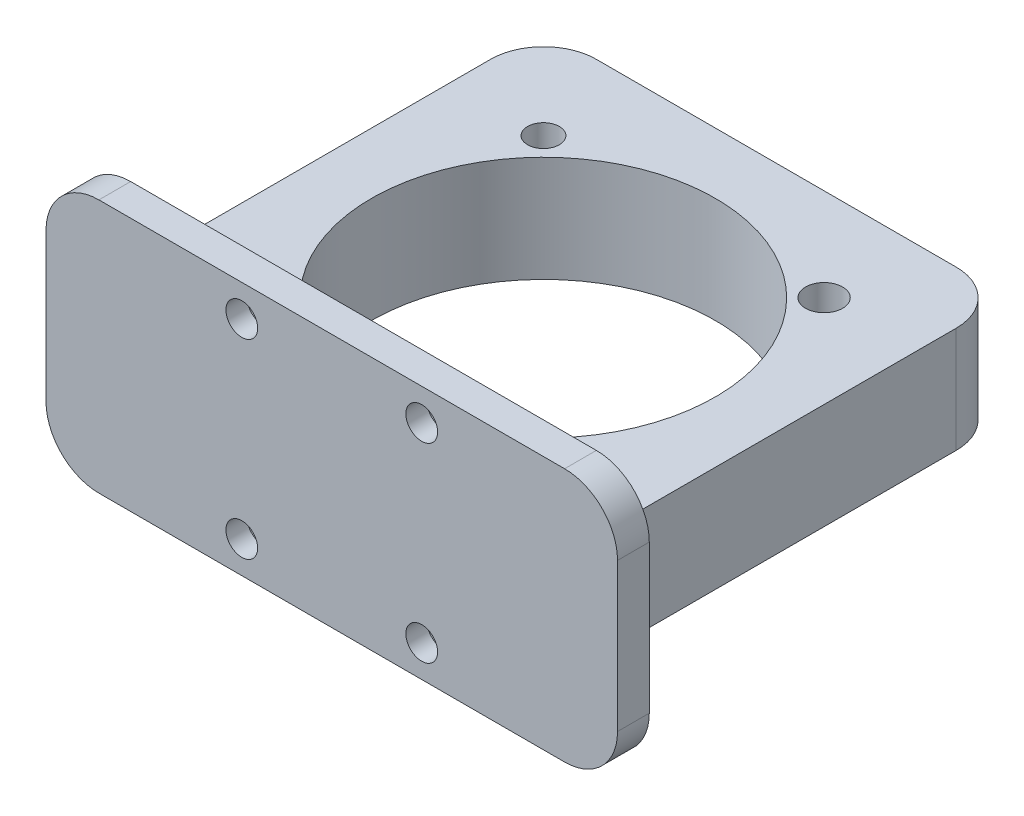
ISO-10303-21;
HEADER;
FILE_DESCRIPTION(('STEP AP214'),'2;1');
FILE_NAME('part.step','',(''),(''),'','','');
FILE_SCHEMA(('AUTOMOTIVE_DESIGN { 1 0 10303 214 1 1 1 1 }'));
ENDSEC;
DATA;
#1=APPLICATION_CONTEXT('core data for automotive mechanical design processes');
#2=APPLICATION_PROTOCOL_DEFINITION('international standard','automotive_design',2000,#1);
#3=PRODUCT_CONTEXT('',#1,'mechanical');
#4=PRODUCT('Part','Part','',(#3));
#5=PRODUCT_RELATED_PRODUCT_CATEGORY('part','',(#4));
#6=PRODUCT_DEFINITION_FORMATION('','',#4);
#7=PRODUCT_DEFINITION_CONTEXT('part definition',#1,'design');
#8=PRODUCT_DEFINITION('design','',#6,#7);
#9=PRODUCT_DEFINITION_SHAPE('','',#8);
#10=(LENGTH_UNIT() NAMED_UNIT(*) SI_UNIT(.MILLI.,.METRE.));
#11=(NAMED_UNIT(*) PLANE_ANGLE_UNIT() SI_UNIT($,.RADIAN.));
#12=(NAMED_UNIT(*) SI_UNIT($,.STERADIAN.) SOLID_ANGLE_UNIT());
#13=UNCERTAINTY_MEASURE_WITH_UNIT(LENGTH_MEASURE(1.E-05),#10,'distance_accuracy_value','');
#14=(GEOMETRIC_REPRESENTATION_CONTEXT(3) GLOBAL_UNCERTAINTY_ASSIGNED_CONTEXT((#13)) GLOBAL_UNIT_ASSIGNED_CONTEXT((#10,
#11,#12)) REPRESENTATION_CONTEXT('',''));
#15=CARTESIAN_POINT('',(0.,0.,0.));
#16=DIRECTION('',(0.,0.,1.));
#17=DIRECTION('',(1.,0.,0.));
#18=AXIS2_PLACEMENT_3D('',#15,#16,#17);
#19=CARTESIAN_POINT('',(-8.5,9.,20.));
#20=DIRECTION('',(0.,0.,-1.));
#21=DIRECTION('',(-1.,0.,0.));
#22=AXIS2_PLACEMENT_3D('',#19,#20,#21);
#23=CYLINDRICAL_SURFACE('',#22,1.5);
#24=CARTESIAN_POINT('',(-8.5,9.,20.));
#25=DIRECTION('',(0.,0.,1.));
#26=DIRECTION('',(-1.,0.,0.));
#27=AXIS2_PLACEMENT_3D('',#24,#25,#26);
#28=CIRCLE('',#27,1.5);
#29=CARTESIAN_POINT('',(-10.,9.,20.));
#30=VERTEX_POINT('',#29);
#31=EDGE_CURVE('E295',#30,#30,#28,.T.);
#32=ORIENTED_EDGE('',*,*,#31,.T.);
#33=EDGE_LOOP('',(#32));
#34=FACE_BOUND('',#33,.T.);
#35=CARTESIAN_POINT('',(-8.5,9.,18.));
#36=DIRECTION('',(0.,0.,-1.));
#37=DIRECTION('',(-1.,0.,0.));
#38=AXIS2_PLACEMENT_3D('',#35,#36,#37);
#39=CIRCLE('',#38,1.5);
#40=CARTESIAN_POINT('',(-10.,9.,18.));
#41=VERTEX_POINT('',#40);
#42=EDGE_CURVE('E45',#41,#41,#39,.T.);
#43=ORIENTED_EDGE('',*,*,#42,.T.);
#44=EDGE_LOOP('',(#43));
#45=FACE_BOUND('',#44,.T.);
#46=ADVANCED_FACE('F41',(#34,#45),#23,.F.);
#47=CARTESIAN_POINT('',(8.5,9.,20.));
#48=DIRECTION('',(0.,0.,-1.));
#49=DIRECTION('',(-1.,0.,0.));
#50=AXIS2_PLACEMENT_3D('',#47,#48,#49);
#51=CYLINDRICAL_SURFACE('',#50,1.5);
#52=CARTESIAN_POINT('',(8.5,9.,20.));
#53=DIRECTION('',(0.,0.,-1.));
#54=DIRECTION('',(1.,0.,0.));
#55=AXIS2_PLACEMENT_3D('',#52,#53,#54);
#56=CIRCLE('',#55,1.5);
#57=CARTESIAN_POINT('',(10.,9.,20.));
#58=VERTEX_POINT('',#57);
#59=EDGE_CURVE('E282',#58,#58,#56,.T.);
#60=ORIENTED_EDGE('',*,*,#59,.F.);
#61=EDGE_LOOP('',(#60));
#62=FACE_BOUND('',#61,.T.);
#63=CARTESIAN_POINT('',(8.5,9.,18.));
#64=DIRECTION('',(0.,0.,-1.));
#65=DIRECTION('',(-1.,0.,0.));
#66=AXIS2_PLACEMENT_3D('',#63,#64,#65);
#67=CIRCLE('',#66,1.5);
#68=CARTESIAN_POINT('',(7.,9.,18.));
#69=VERTEX_POINT('',#68);
#70=EDGE_CURVE('E280',#69,#69,#67,.F.);
#71=ORIENTED_EDGE('',*,*,#70,.F.);
#72=EDGE_LOOP('',(#71));
#73=FACE_BOUND('',#72,.T.);
#74=ADVANCED_FACE('F360',(#62,#73),#51,.F.);
#75=CARTESIAN_POINT('',(8.5,-9.,20.));
#76=DIRECTION('',(0.,0.,-1.));
#77=DIRECTION('',(-1.,0.,0.));
#78=AXIS2_PLACEMENT_3D('',#75,#76,#77);
#79=CYLINDRICAL_SURFACE('',#78,1.5);
#80=CARTESIAN_POINT('',(8.5,-9.,20.));
#81=DIRECTION('',(0.,0.,1.));
#82=DIRECTION('',(1.,0.,0.));
#83=AXIS2_PLACEMENT_3D('',#80,#81,#82);
#84=CIRCLE('',#83,1.5);
#85=CARTESIAN_POINT('',(10.,-9.,20.));
#86=VERTEX_POINT('',#85);
#87=EDGE_CURVE('E278',#86,#86,#84,.T.);
#88=ORIENTED_EDGE('',*,*,#87,.T.);
#89=EDGE_LOOP('',(#88));
#90=FACE_BOUND('',#89,.T.);
#91=CARTESIAN_POINT('',(8.5,-9.,18.));
#92=DIRECTION('',(0.,0.,-1.));
#93=DIRECTION('',(-1.,0.,0.));
#94=AXIS2_PLACEMENT_3D('',#91,#92,#93);
#95=CIRCLE('',#94,1.5);
#96=CARTESIAN_POINT('',(7.,-9.,18.));
#97=VERTEX_POINT('',#96);
#98=EDGE_CURVE('E276',#97,#97,#95,.T.);
#99=ORIENTED_EDGE('',*,*,#98,.T.);
#100=EDGE_LOOP('',(#99));
#101=FACE_BOUND('',#100,.T.);
#102=ADVANCED_FACE('F367',(#90,#101),#79,.F.);
#103=CARTESIAN_POINT('',(-8.5,-9.,20.));
#104=DIRECTION('',(0.,0.,-1.));
#105=DIRECTION('',(-1.,0.,0.));
#106=AXIS2_PLACEMENT_3D('',#103,#104,#105);
#107=CYLINDRICAL_SURFACE('',#106,1.5);
#108=CARTESIAN_POINT('',(-8.5,-9.,20.));
#109=DIRECTION('',(0.,0.,-1.));
#110=DIRECTION('',(-1.,0.,0.));
#111=AXIS2_PLACEMENT_3D('',#108,#109,#110);
#112=CIRCLE('',#111,1.5);
#113=CARTESIAN_POINT('',(-10.,-9.,20.));
#114=VERTEX_POINT('',#113);
#115=EDGE_CURVE('E274',#114,#114,#112,.T.);
#116=CARTESIAN_POINT('',(-8.5,-9.,18.));
#117=DIRECTION('',(0.,0.,-1.));
#118=DIRECTION('',(-1.,0.,0.));
#119=AXIS2_PLACEMENT_3D('',#116,#117,#118);
#120=CIRCLE('',#119,1.5);
#121=CARTESIAN_POINT('',(-10.,-9.,18.));
#122=VERTEX_POINT('',#121);
#123=EDGE_CURVE('E271',#122,#122,#120,.F.);
#124=CARTESIAN_POINT('',(-10.,-9.,20.));
#125=CARTESIAN_POINT('',(-10.,-9.,19.9791666666667));
#126=CARTESIAN_POINT('',(-10.,-9.,19.9583333333333));
#127=CARTESIAN_POINT('',(-10.,-9.,19.9166666666667));
#128=CARTESIAN_POINT('',(-10.,-9.,19.8958333333333));
#129=CARTESIAN_POINT('',(-10.,-9.,19.8541666666667));
#130=CARTESIAN_POINT('',(-10.,-9.,19.8333333333333));
#131=CARTESIAN_POINT('',(-10.,-9.,19.7916666666667));
#132=CARTESIAN_POINT('',(-10.,-9.,19.7708333333333));
#133=CARTESIAN_POINT('',(-10.,-9.,19.7291666666667));
#134=CARTESIAN_POINT('',(-10.,-9.,19.7083333333333));
#135=CARTESIAN_POINT('',(-10.,-9.,19.6666666666667));
#136=CARTESIAN_POINT('',(-10.,-9.,19.6458333333333));
#137=CARTESIAN_POINT('',(-10.,-9.,19.6041666666667));
#138=CARTESIAN_POINT('',(-10.,-9.,19.5833333333333));
#139=CARTESIAN_POINT('',(-10.,-9.,19.5416666666667));
#140=CARTESIAN_POINT('',(-10.,-9.,19.5208333333333));
#141=CARTESIAN_POINT('',(-10.,-9.,19.4791666666667));
#142=CARTESIAN_POINT('',(-10.,-9.,19.4583333333333));
#143=CARTESIAN_POINT('',(-10.,-9.,19.4166666666667));
#144=CARTESIAN_POINT('',(-10.,-9.,19.3958333333333));
#145=CARTESIAN_POINT('',(-10.,-9.,19.3541666666667));
#146=CARTESIAN_POINT('',(-10.,-9.,19.3333333333333));
#147=CARTESIAN_POINT('',(-10.,-9.,19.2916666666667));
#148=CARTESIAN_POINT('',(-10.,-9.,19.2708333333333));
#149=CARTESIAN_POINT('',(-10.,-9.,19.2291666666667));
#150=CARTESIAN_POINT('',(-10.,-9.,19.2083333333333));
#151=CARTESIAN_POINT('',(-10.,-9.,19.1666666666667));
#152=CARTESIAN_POINT('',(-10.,-9.,19.1458333333333));
#153=CARTESIAN_POINT('',(-10.,-9.,19.1041666666667));
#154=CARTESIAN_POINT('',(-10.,-9.,19.0833333333333));
#155=CARTESIAN_POINT('',(-10.,-9.,19.0416666666667));
#156=CARTESIAN_POINT('',(-10.,-9.,19.0208333333333));
#157=CARTESIAN_POINT('',(-10.,-9.,18.9791666666667));
#158=CARTESIAN_POINT('',(-10.,-9.,18.9583333333333));
#159=CARTESIAN_POINT('',(-10.,-9.,18.9166666666667));
#160=CARTESIAN_POINT('',(-10.,-9.,18.8958333333333));
#161=CARTESIAN_POINT('',(-10.,-9.,18.8541666666667));
#162=CARTESIAN_POINT('',(-10.,-9.,18.8333333333333));
#163=CARTESIAN_POINT('',(-10.,-9.,18.7916666666667));
#164=CARTESIAN_POINT('',(-10.,-9.,18.7708333333333));
#165=CARTESIAN_POINT('',(-10.,-9.,18.7291666666667));
#166=CARTESIAN_POINT('',(-10.,-9.,18.7083333333333));
#167=CARTESIAN_POINT('',(-10.,-9.,18.6666666666667));
#168=CARTESIAN_POINT('',(-10.,-9.,18.6458333333333));
#169=CARTESIAN_POINT('',(-10.,-9.,18.6041666666667));
#170=CARTESIAN_POINT('',(-10.,-9.,18.5833333333333));
#171=CARTESIAN_POINT('',(-10.,-9.,18.5416666666667));
#172=CARTESIAN_POINT('',(-10.,-9.,18.5208333333333));
#173=CARTESIAN_POINT('',(-10.,-9.,18.4791666666667));
#174=CARTESIAN_POINT('',(-10.,-9.,18.4583333333333));
#175=CARTESIAN_POINT('',(-10.,-9.,18.4166666666667));
#176=CARTESIAN_POINT('',(-10.,-9.,18.3958333333333));
#177=CARTESIAN_POINT('',(-10.,-9.,18.3541666666667));
#178=CARTESIAN_POINT('',(-10.,-9.,18.3333333333333));
#179=CARTESIAN_POINT('',(-10.,-9.,18.2916666666667));
#180=CARTESIAN_POINT('',(-10.,-9.,18.2708333333333));
#181=CARTESIAN_POINT('',(-10.,-9.,18.2291666666667));
#182=CARTESIAN_POINT('',(-10.,-9.,18.2083333333333));
#183=CARTESIAN_POINT('',(-10.,-9.,18.1666666666667));
#184=CARTESIAN_POINT('',(-10.,-9.,18.1458333333333));
#185=CARTESIAN_POINT('',(-10.,-9.,18.1041666666667));
#186=CARTESIAN_POINT('',(-10.,-9.,18.0833333333333));
#187=CARTESIAN_POINT('',(-10.,-9.,18.0416666666667));
#188=CARTESIAN_POINT('',(-10.,-9.,18.0208333333333));
#189=CARTESIAN_POINT('',(-10.,-9.,18.));
#190=B_SPLINE_CURVE_WITH_KNOTS('',3,(#124,#125,#126,#127,#128,#129,#130,#131,#132,#133,#134,
#135,#136,#137,#138,#139,#140,#141,#142,#143,#144,#145,#146,#147,#148,#149,#150,#151,#152,#153,
#154,#155,#156,#157,#158,#159,#160,#161,#162,#163,#164,#165,#166,#167,#168,#169,#170,#171,#172,
#173,#174,#175,#176,#177,#178,#179,#180,#181,#182,#183,#184,#185,#186,#187,#188,#189),
.UNSPECIFIED.,.F.,.F.,(4,2,2,2,2,2,2,2,2,2,2,2,2,2,2,2,2,2,2,2,2,2,2,2,2,2,2,2,2,2,2,2,4),(0.,
0.0625000000000035,0.125000000000004,0.187500000000004,0.250000000000004,0.312500000000004,
0.375000000000004,0.437500000000004,0.500000000000004,0.562500000000004,0.625000000000004,
0.687500000000004,0.750000000000004,0.812500000000004,0.875000000000004,0.937500000000004,1.,
1.0625,1.125,1.1875,1.25,1.3125,1.375,1.4375,1.5,1.5625,1.625,1.6875,1.75000000000001,
1.81250000000001,1.87500000000001,1.93750000000001,2.00000000000001),.UNSPECIFIED.);
#191=EDGE_CURVE('BSEAM393',#114,#122,#190,.T.);
#192=ORIENTED_EDGE('',*,*,#115,.F.);
#193=ORIENTED_EDGE('',*,*,#123,.F.);
#194=ORIENTED_EDGE('',*,*,#191,.T.);
#195=ORIENTED_EDGE('',*,*,#191,.F.);
#196=EDGE_LOOP('',(#192,#194,#193,#195));
#197=FACE_BOUND('',#196,.T.);
#198=ADVANCED_FACE('F393',(#197),#107,.F.);
#199=CARTESIAN_POINT('',(0.,5.,0.));
#200=DIRECTION('',(0.,-1.,0.));
#201=DIRECTION('',(0.,0.,-1.));
#202=AXIS2_PLACEMENT_3D('',#199,#200,#201);
#203=PLANE('',#202);
#204=DIRECTION('',(1.,0.,0.));
#205=VECTOR('',#204,1.);
#206=CARTESIAN_POINT('',(17.,5.,-22.));
#207=LINE('',#206,#205);
#208=CARTESIAN_POINT('',(-17.,5.,-22.));
#209=VERTEX_POINT('',#208);
#210=CARTESIAN_POINT('',(17.,5.,-22.));
#211=VERTEX_POINT('',#210);
#212=EDGE_CURVE('E185',#209,#211,#207,.T.);
#213=ORIENTED_EDGE('',*,*,#212,.F.);
#214=CARTESIAN_POINT('',(-17.,5.,-17.));
#215=DIRECTION('',(0.,-1.,0.));
#216=DIRECTION('',(0.,0.,-1.));
#217=AXIS2_PLACEMENT_3D('',#214,#215,#216);
#218=CIRCLE('',#217,5.);
#219=CARTESIAN_POINT('',(-22.,5.,-17.));
#220=VERTEX_POINT('',#219);
#221=EDGE_CURVE('E237',#209,#220,#218,.F.);
#222=ORIENTED_EDGE('',*,*,#221,.T.);
#223=DIRECTION('',(0.,0.,-1.));
#224=VECTOR('',#223,1.);
#225=CARTESIAN_POINT('',(-22.,5.,-22.));
#226=LINE('',#225,#224);
#227=CARTESIAN_POINT('',(-22.,5.,17.));
#228=VERTEX_POINT('',#227);
#229=EDGE_CURVE('E175',#228,#220,#226,.T.);
#230=ORIENTED_EDGE('',*,*,#229,.F.);
#231=DIRECTION('',(1.,0.,0.));
#232=VECTOR('',#231,1.);
#233=CARTESIAN_POINT('',(17.,5.,17.));
#234=LINE('',#233,#232);
#235=CARTESIAN_POINT('',(22.,5.,17.));
#236=VERTEX_POINT('',#235);
#237=EDGE_CURVE('E168',#228,#236,#234,.T.);
#238=ORIENTED_EDGE('',*,*,#237,.T.);
#239=DIRECTION('',(0.,0.,-1.));
#240=VECTOR('',#239,1.);
#241=CARTESIAN_POINT('',(22.,5.,-22.));
#242=LINE('',#241,#240);
#243=CARTESIAN_POINT('',(22.,5.,-17.));
#244=VERTEX_POINT('',#243);
#245=EDGE_CURVE('E173',#236,#244,#242,.T.);
#246=ORIENTED_EDGE('',*,*,#245,.T.);
#247=CARTESIAN_POINT('',(17.,5.,-17.));
#248=DIRECTION('',(0.,-1.,0.));
#249=DIRECTION('',(0.,0.,-1.));
#250=AXIS2_PLACEMENT_3D('',#247,#248,#249);
#251=CIRCLE('',#250,5.);
#252=EDGE_CURVE('E235',#244,#211,#251,.F.);
#253=ORIENTED_EDGE('',*,*,#252,.T.);
#254=EDGE_LOOP('',(#213,#222,#230,#238,#246,#253));
#255=FACE_BOUND('',#254,.T.);
#256=CARTESIAN_POINT('',(0.,5.,0.));
#257=DIRECTION('',(0.,1.,0.));
#258=DIRECTION('',(0.,0.,1.));
#259=AXIS2_PLACEMENT_3D('',#256,#257,#258);
#260=CIRCLE('',#259,16.25);
#261=CARTESIAN_POINT('',(0.,5.,16.25));
#262=VERTEX_POINT('',#261);
#263=EDGE_CURVE('E169',#262,#262,#260,.T.);
#264=ORIENTED_EDGE('',*,*,#263,.F.);
#265=EDGE_LOOP('',(#264));
#266=FACE_BOUND('',#265,.T.);
#267=CARTESIAN_POINT('',(13.2582521472478,5.,-13.2582521472478));
#268=DIRECTION('',(0.,1.,0.));
#269=DIRECTION('',(0.,0.,1.));
#270=AXIS2_PLACEMENT_3D('',#267,#268,#269);
#271=CIRCLE('',#270,1.75);
#272=CARTESIAN_POINT('',(13.2582521472478,5.,-11.5082521472478));
#273=VERTEX_POINT('',#272);
#274=EDGE_CURVE('E213',#273,#273,#271,.T.);
#275=ORIENTED_EDGE('',*,*,#274,.F.);
#276=EDGE_LOOP('',(#275));
#277=FACE_BOUND('',#276,.T.);
#278=CARTESIAN_POINT('',(13.2582521472478,5.,13.2582521472478));
#279=DIRECTION('',(0.,1.,0.));
#280=DIRECTION('',(0.,0.,1.));
#281=AXIS2_PLACEMENT_3D('',#278,#279,#280);
#282=CIRCLE('',#281,1.5);
#283=CARTESIAN_POINT('',(13.2582521472478,5.,14.7582521472478));
#284=VERTEX_POINT('',#283);
#285=EDGE_CURVE('E207',#284,#284,#282,.T.);
#286=ORIENTED_EDGE('',*,*,#285,.F.);
#287=EDGE_LOOP('',(#286));
#288=FACE_BOUND('',#287,.T.);
#289=CARTESIAN_POINT('',(-13.2582521472478,5.,-13.2582521472478));
#290=DIRECTION('',(0.,1.,0.));
#291=DIRECTION('',(0.,0.,1.));
#292=AXIS2_PLACEMENT_3D('',#289,#290,#291);
#293=CIRCLE('',#292,1.5);
#294=CARTESIAN_POINT('',(-13.2582521472478,5.,-11.7582521472478));
#295=VERTEX_POINT('',#294);
#296=EDGE_CURVE('E201',#295,#295,#293,.T.);
#297=ORIENTED_EDGE('',*,*,#296,.F.);
#298=EDGE_LOOP('',(#297));
#299=FACE_BOUND('',#298,.T.);
#300=CARTESIAN_POINT('',(-13.2582521472478,5.,13.2582521472478));
#301=DIRECTION('',(0.,1.,0.));
#302=DIRECTION('',(0.,0.,1.));
#303=AXIS2_PLACEMENT_3D('',#300,#301,#302);
#304=CIRCLE('',#303,1.75);
#305=CARTESIAN_POINT('',(-13.2582521472478,5.,15.0082521472478));
#306=VERTEX_POINT('',#305);
#307=EDGE_CURVE('E195',#306,#306,#304,.T.);
#308=ORIENTED_EDGE('',*,*,#307,.F.);
#309=EDGE_LOOP('',(#308));
#310=FACE_BOUND('',#309,.T.);
#311=ADVANCED_FACE('F341',(#255,#266,#277,#288,#299,#310),#203,.F.);
#312=CARTESIAN_POINT('',(0.,-5.,0.));
#313=DIRECTION('',(0.,-1.,0.));
#314=DIRECTION('',(0.,0.,-1.));
#315=AXIS2_PLACEMENT_3D('',#312,#313,#314);
#316=PLANE('',#315);
#317=CARTESIAN_POINT('',(-13.2582521472478,-5.,-13.2582521472478));
#318=DIRECTION('',(0.,1.,0.));
#319=DIRECTION('',(0.,0.,1.));
#320=AXIS2_PLACEMENT_3D('',#317,#318,#319);
#321=CIRCLE('',#320,1.5);
#322=CARTESIAN_POINT('',(-13.2582521472478,-5.,-11.7582521472478));
#323=VERTEX_POINT('',#322);
#324=EDGE_CURVE('E198',#323,#323,#321,.T.);
#325=ORIENTED_EDGE('',*,*,#324,.T.);
#326=EDGE_LOOP('',(#325));
#327=FACE_BOUND('',#326,.T.);
#328=CARTESIAN_POINT('',(13.2582521472478,-5.,-13.2582521472478));
#329=DIRECTION('',(0.,1.,0.));
#330=DIRECTION('',(0.,0.,1.));
#331=AXIS2_PLACEMENT_3D('',#328,#329,#330);
#332=CIRCLE('',#331,1.75);
#333=CARTESIAN_POINT('',(13.2582521472478,-5.,-11.5082521472478));
#334=VERTEX_POINT('',#333);
#335=EDGE_CURVE('E210',#334,#334,#332,.T.);
#336=ORIENTED_EDGE('',*,*,#335,.T.);
#337=EDGE_LOOP('',(#336));
#338=FACE_BOUND('',#337,.T.);
#339=DIRECTION('',(0.,0.,-1.));
#340=VECTOR('',#339,1.);
#341=CARTESIAN_POINT('',(-22.,-5.,17.));
#342=LINE('',#341,#340);
#343=CARTESIAN_POINT('',(-22.,-5.,17.));
#344=VERTEX_POINT('',#343);
#345=CARTESIAN_POINT('',(-22.,-5.,-17.));
#346=VERTEX_POINT('',#345);
#347=EDGE_CURVE('E157',#344,#346,#342,.T.);
#348=ORIENTED_EDGE('',*,*,#347,.T.);
#349=CARTESIAN_POINT('',(-17.,-5.,-17.));
#350=DIRECTION('',(0.,-1.,0.));
#351=DIRECTION('',(0.,0.,-1.));
#352=AXIS2_PLACEMENT_3D('',#349,#350,#351);
#353=CIRCLE('',#352,5.);
#354=CARTESIAN_POINT('',(-17.,-5.,-22.));
#355=VERTEX_POINT('',#354);
#356=EDGE_CURVE('E228',#346,#355,#353,.T.);
#357=ORIENTED_EDGE('',*,*,#356,.T.);
#358=DIRECTION('',(-1.,0.,0.));
#359=VECTOR('',#358,1.);
#360=CARTESIAN_POINT('',(17.,-5.,-22.));
#361=LINE('',#360,#359);
#362=CARTESIAN_POINT('',(17.,-5.,-22.));
#363=VERTEX_POINT('',#362);
#364=EDGE_CURVE('E182',#363,#355,#361,.T.);
#365=ORIENTED_EDGE('',*,*,#364,.F.);
#366=CARTESIAN_POINT('',(17.,-5.,-17.));
#367=DIRECTION('',(0.,-1.,0.));
#368=DIRECTION('',(0.,0.,-1.));
#369=AXIS2_PLACEMENT_3D('',#366,#367,#368);
#370=CIRCLE('',#369,5.);
#371=CARTESIAN_POINT('',(22.,-5.,-17.));
#372=VERTEX_POINT('',#371);
#373=EDGE_CURVE('E153',#363,#372,#370,.T.);
#374=ORIENTED_EDGE('',*,*,#373,.T.);
#375=DIRECTION('',(0.,0.,1.));
#376=VECTOR('',#375,1.);
#377=CARTESIAN_POINT('',(22.,-5.,-22.));
#378=LINE('',#377,#376);
#379=CARTESIAN_POINT('',(22.,-5.,17.));
#380=VERTEX_POINT('',#379);
#381=EDGE_CURVE('E145',#372,#380,#378,.T.);
#382=ORIENTED_EDGE('',*,*,#381,.T.);
#383=DIRECTION('',(1.,0.,0.));
#384=VECTOR('',#383,1.);
#385=CARTESIAN_POINT('',(17.,-5.,17.));
#386=LINE('',#385,#384);
#387=EDGE_CURVE('E150',#344,#380,#386,.T.);
#388=ORIENTED_EDGE('',*,*,#387,.F.);
#389=EDGE_LOOP('',(#348,#357,#365,#374,#382,#388));
#390=FACE_BOUND('',#389,.T.);
#391=CARTESIAN_POINT('',(0.,-5.,0.));
#392=DIRECTION('',(0.,1.,0.));
#393=DIRECTION('',(0.,0.,1.));
#394=AXIS2_PLACEMENT_3D('',#391,#392,#393);
#395=CIRCLE('',#394,16.25);
#396=CARTESIAN_POINT('',(0.,-5.,16.25));
#397=VERTEX_POINT('',#396);
#398=EDGE_CURVE('E216',#397,#397,#395,.T.);
#399=ORIENTED_EDGE('',*,*,#398,.T.);
#400=EDGE_LOOP('',(#399));
#401=FACE_BOUND('',#400,.T.);
#402=CARTESIAN_POINT('',(13.2582521472478,-5.,13.2582521472478));
#403=DIRECTION('',(0.,1.,0.));
#404=DIRECTION('',(0.,0.,1.));
#405=AXIS2_PLACEMENT_3D('',#402,#403,#404);
#406=CIRCLE('',#405,1.5);
#407=CARTESIAN_POINT('',(13.2582521472478,-5.,14.7582521472478));
#408=VERTEX_POINT('',#407);
#409=EDGE_CURVE('E204',#408,#408,#406,.T.);
#410=ORIENTED_EDGE('',*,*,#409,.T.);
#411=EDGE_LOOP('',(#410));
#412=FACE_BOUND('',#411,.T.);
#413=CARTESIAN_POINT('',(-13.2582521472478,-5.,13.2582521472478));
#414=DIRECTION('',(0.,1.,0.));
#415=DIRECTION('',(0.,0.,1.));
#416=AXIS2_PLACEMENT_3D('',#413,#414,#415);
#417=CIRCLE('',#416,1.75);
#418=CARTESIAN_POINT('',(-13.2582521472478,-5.,15.0082521472478));
#419=VERTEX_POINT('',#418);
#420=EDGE_CURVE('E194',#419,#419,#417,.T.);
#421=ORIENTED_EDGE('',*,*,#420,.T.);
#422=EDGE_LOOP('',(#421));
#423=FACE_BOUND('',#422,.T.);
#424=ADVANCED_FACE('F148',(#327,#338,#390,#401,#412,#423),#316,.T.);
#425=CARTESIAN_POINT('',(0.,5.,0.));
#426=DIRECTION('',(0.,-1.,0.));
#427=DIRECTION('',(0.,0.,-1.));
#428=AXIS2_PLACEMENT_3D('',#425,#426,#427);
#429=CYLINDRICAL_SURFACE('',#428,16.25);
#430=ORIENTED_EDGE('',*,*,#263,.T.);
#431=EDGE_LOOP('',(#430));
#432=FACE_BOUND('',#431,.T.);
#433=ORIENTED_EDGE('',*,*,#398,.F.);
#434=EDGE_LOOP('',(#433));
#435=FACE_BOUND('',#434,.T.);
#436=ADVANCED_FACE('F446',(#432,#435),#429,.F.);
#437=CARTESIAN_POINT('',(13.2582521472478,5.,-13.2582521472478));
#438=DIRECTION('',(0.,-1.,0.));
#439=DIRECTION('',(0.,0.,-1.));
#440=AXIS2_PLACEMENT_3D('',#437,#438,#439);
#441=CYLINDRICAL_SURFACE('',#440,1.75);
#442=ORIENTED_EDGE('',*,*,#274,.T.);
#443=EDGE_LOOP('',(#442));
#444=FACE_BOUND('',#443,.T.);
#445=ORIENTED_EDGE('',*,*,#335,.F.);
#446=EDGE_LOOP('',(#445));
#447=FACE_BOUND('',#446,.T.);
#448=ADVANCED_FACE('F442',(#444,#447),#441,.F.);
#449=CARTESIAN_POINT('',(13.2582521472478,5.,13.2582521472478));
#450=DIRECTION('',(0.,-1.,0.));
#451=DIRECTION('',(0.,0.,-1.));
#452=AXIS2_PLACEMENT_3D('',#449,#450,#451);
#453=CYLINDRICAL_SURFACE('',#452,1.5);
#454=ORIENTED_EDGE('',*,*,#285,.T.);
#455=EDGE_LOOP('',(#454));
#456=FACE_BOUND('',#455,.T.);
#457=ORIENTED_EDGE('',*,*,#409,.F.);
#458=EDGE_LOOP('',(#457));
#459=FACE_BOUND('',#458,.T.);
#460=ADVANCED_FACE('F438',(#456,#459),#453,.F.);
#461=CARTESIAN_POINT('',(-13.2582521472478,5.,-13.2582521472478));
#462=DIRECTION('',(0.,-1.,0.));
#463=DIRECTION('',(0.,0.,-1.));
#464=AXIS2_PLACEMENT_3D('',#461,#462,#463);
#465=CYLINDRICAL_SURFACE('',#464,1.5);
#466=ORIENTED_EDGE('',*,*,#296,.T.);
#467=EDGE_LOOP('',(#466));
#468=FACE_BOUND('',#467,.T.);
#469=ORIENTED_EDGE('',*,*,#324,.F.);
#470=EDGE_LOOP('',(#469));
#471=FACE_BOUND('',#470,.T.);
#472=ADVANCED_FACE('F434',(#468,#471),#465,.F.);
#473=CARTESIAN_POINT('',(-13.2582521472478,5.,13.2582521472478));
#474=DIRECTION('',(0.,-1.,0.));
#475=DIRECTION('',(0.,0.,-1.));
#476=AXIS2_PLACEMENT_3D('',#473,#474,#475);
#477=CYLINDRICAL_SURFACE('',#476,1.75);
#478=ORIENTED_EDGE('',*,*,#307,.T.);
#479=EDGE_LOOP('',(#478));
#480=FACE_BOUND('',#479,.T.);
#481=ORIENTED_EDGE('',*,*,#420,.F.);
#482=EDGE_LOOP('',(#481));
#483=FACE_BOUND('',#482,.T.);
#484=ADVANCED_FACE('F430',(#480,#483),#477,.F.);
#485=CARTESIAN_POINT('',(17.,12.,17.));
#486=DIRECTION('',(0.,0.,1.));
#487=DIRECTION('',(1.,0.,0.));
#488=AXIS2_PLACEMENT_3D('',#485,#486,#487);
#489=PLANE('',#488);
#490=CARTESIAN_POINT('',(-8.5,9.,17.));
#491=DIRECTION('',(0.,0.,1.));
#492=DIRECTION('',(-1.,0.,0.));
#493=AXIS2_PLACEMENT_3D('',#490,#491,#492);
#494=CIRCLE('',#493,2.);
#495=CARTESIAN_POINT('',(-10.5,9.,17.));
#496=VERTEX_POINT('',#495);
#497=EDGE_CURVE('E608',#496,#496,#494,.T.);
#498=ORIENTED_EDGE('',*,*,#497,.T.);
#499=EDGE_LOOP('',(#498));
#500=FACE_BOUND('',#499,.T.);
#501=CARTESIAN_POINT('',(8.5,9.,17.));
#502=DIRECTION('',(0.,0.,-1.));
#503=DIRECTION('',(1.,0.,0.));
#504=AXIS2_PLACEMENT_3D('',#501,#502,#503);
#505=CIRCLE('',#504,2.);
#506=CARTESIAN_POINT('',(10.5,9.,17.));
#507=VERTEX_POINT('',#506);
#508=EDGE_CURVE('E290',#507,#507,#505,.T.);
#509=ORIENTED_EDGE('',*,*,#508,.F.);
#510=EDGE_LOOP('',(#509));
#511=FACE_BOUND('',#510,.T.);
#512=CARTESIAN_POINT('',(8.5,-9.,17.));
#513=DIRECTION('',(0.,0.,1.));
#514=DIRECTION('',(1.,0.,0.));
#515=AXIS2_PLACEMENT_3D('',#512,#513,#514);
#516=CIRCLE('',#515,2.);
#517=CARTESIAN_POINT('',(10.5,-9.,17.));
#518=VERTEX_POINT('',#517);
#519=EDGE_CURVE('E287',#518,#518,#516,.T.);
#520=ORIENTED_EDGE('',*,*,#519,.T.);
#521=EDGE_LOOP('',(#520));
#522=FACE_BOUND('',#521,.T.);
#523=CARTESIAN_POINT('',(-8.5,-9.,17.));
#524=DIRECTION('',(0.,0.,-1.));
#525=DIRECTION('',(-1.,0.,0.));
#526=AXIS2_PLACEMENT_3D('',#523,#524,#525);
#527=CIRCLE('',#526,2.);
#528=CARTESIAN_POINT('',(-10.5,-9.,17.));
#529=VERTEX_POINT('',#528);
#530=EDGE_CURVE('E306',#529,#529,#527,.T.);
#531=ORIENTED_EDGE('',*,*,#530,.F.);
#532=EDGE_LOOP('',(#531));
#533=FACE_BOUND('',#532,.T.);
#534=ORIENTED_EDGE('',*,*,#387,.T.);
#535=DIRECTION('',(0.,1.,0.));
#536=VECTOR('',#535,1.);
#537=CARTESIAN_POINT('',(22.,5.,17.));
#538=LINE('',#537,#536);
#539=EDGE_CURVE('E164',#380,#236,#538,.T.);
#540=ORIENTED_EDGE('',*,*,#539,.T.);
#541=ORIENTED_EDGE('',*,*,#237,.F.);
#542=DIRECTION('',(0.,1.,0.));
#543=VECTOR('',#542,1.);
#544=CARTESIAN_POINT('',(-22.,5.,17.));
#545=LINE('',#544,#543);
#546=EDGE_CURVE('E167',#344,#228,#545,.T.);
#547=ORIENTED_EDGE('',*,*,#546,.F.);
#548=EDGE_LOOP('',(#534,#540,#541,#547));
#549=FACE_BOUND('',#548,.T.);
#550=DIRECTION('',(0.,-1.,0.));
#551=VECTOR('',#550,1.);
#552=CARTESIAN_POINT('',(-27.,12.,17.));
#553=LINE('',#552,#551);
#554=CARTESIAN_POINT('',(-27.,7.,17.));
#555=VERTEX_POINT('',#554);
#556=CARTESIAN_POINT('',(-27.,-7.,17.));
#557=VERTEX_POINT('',#556);
#558=EDGE_CURVE('E318',#555,#557,#553,.T.);
#559=ORIENTED_EDGE('',*,*,#558,.F.);
#560=CARTESIAN_POINT('',(-22.,7.,17.));
#561=DIRECTION('',(0.,0.,1.));
#562=DIRECTION('',(1.,0.,0.));
#563=AXIS2_PLACEMENT_3D('',#560,#561,#562);
#564=CIRCLE('',#563,5.);
#565=CARTESIAN_POINT('',(-22.,12.,17.));
#566=VERTEX_POINT('',#565);
#567=EDGE_CURVE('E253',#555,#566,#564,.F.);
#568=ORIENTED_EDGE('',*,*,#567,.T.);
#569=DIRECTION('',(-1.,0.,0.));
#570=VECTOR('',#569,1.);
#571=CARTESIAN_POINT('',(17.,12.,17.));
#572=LINE('',#571,#570);
#573=CARTESIAN_POINT('',(22.,12.,17.));
#574=VERTEX_POINT('',#573);
#575=EDGE_CURVE('E188',#574,#566,#572,.T.);
#576=ORIENTED_EDGE('',*,*,#575,.F.);
#577=CARTESIAN_POINT('',(22.,7.,17.));
#578=DIRECTION('',(0.,0.,1.));
#579=DIRECTION('',(1.,0.,0.));
#580=AXIS2_PLACEMENT_3D('',#577,#578,#579);
#581=CIRCLE('',#580,5.);
#582=CARTESIAN_POINT('',(27.,7.,17.));
#583=VERTEX_POINT('',#582);
#584=EDGE_CURVE('E251',#574,#583,#581,.F.);
#585=ORIENTED_EDGE('',*,*,#584,.T.);
#586=DIRECTION('',(0.,-1.,0.));
#587=VECTOR('',#586,1.);
#588=CARTESIAN_POINT('',(27.,12.,17.));
#589=LINE('',#588,#587);
#590=CARTESIAN_POINT('',(27.,-7.,17.));
#591=VERTEX_POINT('',#590);
#592=EDGE_CURVE('E313',#583,#591,#589,.T.);
#593=ORIENTED_EDGE('',*,*,#592,.T.);
#594=CARTESIAN_POINT('',(22.,-7.,17.));
#595=DIRECTION('',(0.,0.,1.));
#596=DIRECTION('',(1.,0.,0.));
#597=AXIS2_PLACEMENT_3D('',#594,#595,#596);
#598=CIRCLE('',#597,5.);
#599=CARTESIAN_POINT('',(22.,-12.,17.));
#600=VERTEX_POINT('',#599);
#601=EDGE_CURVE('E249',#591,#600,#598,.F.);
#602=ORIENTED_EDGE('',*,*,#601,.T.);
#603=DIRECTION('',(1.,0.,0.));
#604=VECTOR('',#603,1.);
#605=CARTESIAN_POINT('',(-17.,-12.,17.));
#606=LINE('',#605,#604);
#607=CARTESIAN_POINT('',(-22.,-12.,17.));
#608=VERTEX_POINT('',#607);
#609=EDGE_CURVE('E324',#608,#600,#606,.T.);
#610=ORIENTED_EDGE('',*,*,#609,.F.);
#611=CARTESIAN_POINT('',(-22.,-7.,17.));
#612=DIRECTION('',(0.,0.,1.));
#613=DIRECTION('',(1.,0.,0.));
#614=AXIS2_PLACEMENT_3D('',#611,#612,#613);
#615=CIRCLE('',#614,5.);
#616=EDGE_CURVE('E247',#608,#557,#615,.F.);
#617=ORIENTED_EDGE('',*,*,#616,.T.);
#618=EDGE_LOOP('',(#559,#568,#576,#585,#593,#602,#610,#617));
#619=FACE_BOUND('',#618,.T.);
#620=ADVANCED_FACE('F162',(#500,#511,#522,#533,#549,#619),#489,.F.);
#621=CARTESIAN_POINT('',(17.,12.,20.));
#622=DIRECTION('',(0.,0.,-1.));
#623=DIRECTION('',(-1.,0.,0.));
#624=AXIS2_PLACEMENT_3D('',#621,#622,#623);
#625=PLANE('',#624);
#626=ORIENTED_EDGE('',*,*,#31,.F.);
#627=EDGE_LOOP('',(#626));
#628=FACE_BOUND('',#627,.T.);
#629=ORIENTED_EDGE('',*,*,#59,.T.);
#630=EDGE_LOOP('',(#629));
#631=FACE_BOUND('',#630,.T.);
#632=ORIENTED_EDGE('',*,*,#87,.F.);
#633=EDGE_LOOP('',(#632));
#634=FACE_BOUND('',#633,.T.);
#635=ORIENTED_EDGE('',*,*,#115,.T.);
#636=EDGE_LOOP('',(#635));
#637=FACE_BOUND('',#636,.T.);
#638=DIRECTION('',(1.,0.,0.));
#639=VECTOR('',#638,1.);
#640=CARTESIAN_POINT('',(17.,12.,20.));
#641=LINE('',#640,#639);
#642=CARTESIAN_POINT('',(-22.,12.,20.));
#643=VERTEX_POINT('',#642);
#644=CARTESIAN_POINT('',(22.,12.,20.));
#645=VERTEX_POINT('',#644);
#646=EDGE_CURVE('E191',#643,#645,#641,.T.);
#647=ORIENTED_EDGE('',*,*,#646,.F.);
#648=CARTESIAN_POINT('',(-22.,7.,20.));
#649=DIRECTION('',(0.,0.,-1.));
#650=DIRECTION('',(-1.,0.,0.));
#651=AXIS2_PLACEMENT_3D('',#648,#649,#650);
#652=CIRCLE('',#651,5.);
#653=CARTESIAN_POINT('',(-27.,7.,20.));
#654=VERTEX_POINT('',#653);
#655=EDGE_CURVE('E265',#643,#654,#652,.F.);
#656=ORIENTED_EDGE('',*,*,#655,.T.);
#657=DIRECTION('',(0.,1.,0.));
#658=VECTOR('',#657,1.);
#659=CARTESIAN_POINT('',(-27.,12.,20.));
#660=LINE('',#659,#658);
#661=CARTESIAN_POINT('',(-27.,-7.,20.));
#662=VERTEX_POINT('',#661);
#663=EDGE_CURVE('E321',#662,#654,#660,.T.);
#664=ORIENTED_EDGE('',*,*,#663,.F.);
#665=CARTESIAN_POINT('',(-22.,-7.,20.));
#666=DIRECTION('',(0.,0.,-1.));
#667=DIRECTION('',(-1.,0.,0.));
#668=AXIS2_PLACEMENT_3D('',#665,#666,#667);
#669=CIRCLE('',#668,5.);
#670=CARTESIAN_POINT('',(-22.,-12.,20.));
#671=VERTEX_POINT('',#670);
#672=EDGE_CURVE('E260',#662,#671,#669,.F.);
#673=ORIENTED_EDGE('',*,*,#672,.T.);
#674=DIRECTION('',(-1.,0.,0.));
#675=VECTOR('',#674,1.);
#676=CARTESIAN_POINT('',(-17.,-12.,20.));
#677=LINE('',#676,#675);
#678=CARTESIAN_POINT('',(22.,-12.,20.));
#679=VERTEX_POINT('',#678);
#680=EDGE_CURVE('E158',#679,#671,#677,.T.);
#681=ORIENTED_EDGE('',*,*,#680,.F.);
#682=CARTESIAN_POINT('',(22.,-7.,20.));
#683=DIRECTION('',(0.,0.,-1.));
#684=DIRECTION('',(-1.,0.,0.));
#685=AXIS2_PLACEMENT_3D('',#682,#683,#684);
#686=CIRCLE('',#685,5.);
#687=CARTESIAN_POINT('',(27.,-7.,20.));
#688=VERTEX_POINT('',#687);
#689=EDGE_CURVE('E65',#679,#688,#686,.F.);
#690=ORIENTED_EDGE('',*,*,#689,.T.);
#691=DIRECTION('',(0.,1.,0.));
#692=VECTOR('',#691,1.);
#693=CARTESIAN_POINT('',(27.,12.,20.));
#694=LINE('',#693,#692);
#695=CARTESIAN_POINT('',(27.,7.,20.));
#696=VERTEX_POINT('',#695);
#697=EDGE_CURVE('E316',#688,#696,#694,.T.);
#698=ORIENTED_EDGE('',*,*,#697,.T.);
#699=CARTESIAN_POINT('',(22.,7.,20.));
#700=DIRECTION('',(0.,0.,-1.));
#701=DIRECTION('',(-1.,0.,0.));
#702=AXIS2_PLACEMENT_3D('',#699,#700,#701);
#703=CIRCLE('',#702,5.);
#704=EDGE_CURVE('E263',#696,#645,#703,.F.);
#705=ORIENTED_EDGE('',*,*,#704,.T.);
#706=EDGE_LOOP('',(#647,#656,#664,#673,#681,#690,#698,#705));
#707=FACE_BOUND('',#706,.T.);
#708=ADVANCED_FACE('F423',(#628,#631,#634,#637,#707),#625,.F.);
#709=CARTESIAN_POINT('',(0.,12.,0.));
#710=DIRECTION('',(0.,-1.,0.));
#711=DIRECTION('',(0.,0.,-1.));
#712=AXIS2_PLACEMENT_3D('',#709,#710,#711);
#713=PLANE('',#712);
#714=ORIENTED_EDGE('',*,*,#575,.T.);
#715=DIRECTION('',(0.,0.,-1.));
#716=VECTOR('',#715,1.);
#717=CARTESIAN_POINT('',(-22.,12.,20.));
#718=LINE('',#717,#716);
#719=EDGE_CURVE('E258',#566,#643,#718,.F.);
#720=ORIENTED_EDGE('',*,*,#719,.T.);
#721=ORIENTED_EDGE('',*,*,#646,.T.);
#722=DIRECTION('',(0.,0.,-1.));
#723=VECTOR('',#722,1.);
#724=CARTESIAN_POINT('',(22.,12.,17.));
#725=LINE('',#724,#723);
#726=EDGE_CURVE('E255',#645,#574,#725,.T.);
#727=ORIENTED_EDGE('',*,*,#726,.T.);
#728=EDGE_LOOP('',(#714,#720,#721,#727));
#729=FACE_BOUND('',#728,.T.);
#730=ADVANCED_FACE('F421',(#729),#713,.F.);
#731=CARTESIAN_POINT('',(0.,0.,-22.));
#732=DIRECTION('',(0.,0.,-1.));
#733=DIRECTION('',(-1.,0.,0.));
#734=AXIS2_PLACEMENT_3D('',#731,#732,#733);
#735=PLANE('',#734);
#736=ORIENTED_EDGE('',*,*,#364,.T.);
#737=DIRECTION('',(0.,-1.,0.));
#738=VECTOR('',#737,1.);
#739=CARTESIAN_POINT('',(-17.,0.,-22.));
#740=LINE('',#739,#738);
#741=EDGE_CURVE('E233',#355,#209,#740,.F.);
#742=ORIENTED_EDGE('',*,*,#741,.T.);
#743=ORIENTED_EDGE('',*,*,#212,.T.);
#744=DIRECTION('',(0.,-1.,0.));
#745=VECTOR('',#744,1.);
#746=CARTESIAN_POINT('',(17.,0.,-22.));
#747=LINE('',#746,#745);
#748=EDGE_CURVE('E230',#211,#363,#747,.T.);
#749=ORIENTED_EDGE('',*,*,#748,.T.);
#750=EDGE_LOOP('',(#736,#742,#743,#749));
#751=FACE_BOUND('',#750,.T.);
#752=ADVANCED_FACE('F338',(#751),#735,.T.);
#753=CARTESIAN_POINT('',(-22.,0.,0.));
#754=DIRECTION('',(-1.,0.,0.));
#755=DIRECTION('',(0.,0.,1.));
#756=AXIS2_PLACEMENT_3D('',#753,#754,#755);
#757=PLANE('',#756);
#758=ORIENTED_EDGE('',*,*,#229,.T.);
#759=DIRECTION('',(0.,-1.,0.));
#760=VECTOR('',#759,1.);
#761=CARTESIAN_POINT('',(-22.,0.,-17.));
#762=LINE('',#761,#760);
#763=EDGE_CURVE('E223',#220,#346,#762,.T.);
#764=ORIENTED_EDGE('',*,*,#763,.T.);
#765=ORIENTED_EDGE('',*,*,#347,.F.);
#766=ORIENTED_EDGE('',*,*,#546,.T.);
#767=EDGE_LOOP('',(#758,#764,#765,#766));
#768=FACE_BOUND('',#767,.T.);
#769=ADVANCED_FACE('F329',(#768),#757,.T.);
#770=CARTESIAN_POINT('',(22.,0.,0.));
#771=DIRECTION('',(1.,0.,0.));
#772=DIRECTION('',(0.,0.,1.));
#773=AXIS2_PLACEMENT_3D('',#770,#771,#772);
#774=PLANE('',#773);
#775=ORIENTED_EDGE('',*,*,#381,.F.);
#776=DIRECTION('',(0.,-1.,0.));
#777=VECTOR('',#776,1.);
#778=CARTESIAN_POINT('',(22.,0.,-17.));
#779=LINE('',#778,#777);
#780=EDGE_CURVE('E239',#372,#244,#779,.F.);
#781=ORIENTED_EDGE('',*,*,#780,.T.);
#782=ORIENTED_EDGE('',*,*,#245,.F.);
#783=ORIENTED_EDGE('',*,*,#539,.F.);
#784=EDGE_LOOP('',(#775,#781,#782,#783));
#785=FACE_BOUND('',#784,.T.);
#786=ADVANCED_FACE('F171',(#785),#774,.T.);
#787=CARTESIAN_POINT('',(0.,-12.,0.));
#788=DIRECTION('',(0.,-1.,0.));
#789=DIRECTION('',(0.,0.,-1.));
#790=AXIS2_PLACEMENT_3D('',#787,#788,#789);
#791=PLANE('',#790);
#792=ORIENTED_EDGE('',*,*,#609,.T.);
#793=DIRECTION('',(0.,0.,1.));
#794=VECTOR('',#793,1.);
#795=CARTESIAN_POINT('',(22.,-12.,0.));
#796=LINE('',#795,#794);
#797=EDGE_CURVE('E11',#600,#679,#796,.T.);
#798=ORIENTED_EDGE('',*,*,#797,.T.);
#799=ORIENTED_EDGE('',*,*,#680,.T.);
#800=DIRECTION('',(0.,0.,1.));
#801=VECTOR('',#800,1.);
#802=CARTESIAN_POINT('',(-22.,-12.,0.));
#803=LINE('',#802,#801);
#804=EDGE_CURVE('E50',#671,#608,#803,.F.);
#805=ORIENTED_EDGE('',*,*,#804,.T.);
#806=EDGE_LOOP('',(#792,#798,#799,#805));
#807=FACE_BOUND('',#806,.T.);
#808=ADVANCED_FACE('F410',(#807),#791,.T.);
#809=CARTESIAN_POINT('',(-27.,0.,0.));
#810=DIRECTION('',(-1.,0.,0.));
#811=DIRECTION('',(0.,0.,1.));
#812=AXIS2_PLACEMENT_3D('',#809,#810,#811);
#813=PLANE('',#812);
#814=ORIENTED_EDGE('',*,*,#663,.T.);
#815=DIRECTION('',(0.,0.,-1.));
#816=VECTOR('',#815,1.);
#817=CARTESIAN_POINT('',(-27.,7.,17.));
#818=LINE('',#817,#816);
#819=EDGE_CURVE('E244',#654,#555,#818,.T.);
#820=ORIENTED_EDGE('',*,*,#819,.T.);
#821=ORIENTED_EDGE('',*,*,#558,.T.);
#822=DIRECTION('',(0.,0.,1.));
#823=VECTOR('',#822,1.);
#824=CARTESIAN_POINT('',(-27.,-7.,0.));
#825=LINE('',#824,#823);
#826=EDGE_CURVE('E241',#557,#662,#825,.T.);
#827=ORIENTED_EDGE('',*,*,#826,.T.);
#828=EDGE_LOOP('',(#814,#820,#821,#827));
#829=FACE_BOUND('',#828,.T.);
#830=ADVANCED_FACE('F407',(#829),#813,.T.);
#831=CARTESIAN_POINT('',(27.,0.,0.));
#832=DIRECTION('',(1.,0.,0.));
#833=DIRECTION('',(0.,0.,1.));
#834=AXIS2_PLACEMENT_3D('',#831,#832,#833);
#835=PLANE('',#834);
#836=ORIENTED_EDGE('',*,*,#592,.F.);
#837=DIRECTION('',(0.,0.,-1.));
#838=VECTOR('',#837,1.);
#839=CARTESIAN_POINT('',(27.,7.,20.));
#840=LINE('',#839,#838);
#841=EDGE_CURVE('E58',#583,#696,#840,.F.);
#842=ORIENTED_EDGE('',*,*,#841,.T.);
#843=ORIENTED_EDGE('',*,*,#697,.F.);
#844=DIRECTION('',(0.,0.,1.));
#845=VECTOR('',#844,1.);
#846=CARTESIAN_POINT('',(27.,-7.,0.));
#847=LINE('',#846,#845);
#848=EDGE_CURVE('E267',#688,#591,#847,.F.);
#849=ORIENTED_EDGE('',*,*,#848,.T.);
#850=EDGE_LOOP('',(#836,#842,#843,#849));
#851=FACE_BOUND('',#850,.T.);
#852=ADVANCED_FACE('F357',(#851),#835,.T.);
#853=CARTESIAN_POINT('',(-17.,0.,-17.));
#854=DIRECTION('',(0.,-1.,0.));
#855=DIRECTION('',(0.,0.,-1.));
#856=AXIS2_PLACEMENT_3D('',#853,#854,#855);
#857=CYLINDRICAL_SURFACE('',#856,5.);
#858=ORIENTED_EDGE('',*,*,#221,.F.);
#859=ORIENTED_EDGE('',*,*,#741,.F.);
#860=ORIENTED_EDGE('',*,*,#356,.F.);
#861=ORIENTED_EDGE('',*,*,#763,.F.);
#862=EDGE_LOOP('',(#858,#859,#860,#861));
#863=FACE_BOUND('',#862,.T.);
#864=ADVANCED_FACE('F334',(#863),#857,.T.);
#865=CARTESIAN_POINT('',(17.,0.,-17.));
#866=DIRECTION('',(0.,-1.,0.));
#867=DIRECTION('',(0.,0.,-1.));
#868=AXIS2_PLACEMENT_3D('',#865,#866,#867);
#869=CYLINDRICAL_SURFACE('',#868,5.);
#870=ORIENTED_EDGE('',*,*,#252,.F.);
#871=ORIENTED_EDGE('',*,*,#780,.F.);
#872=ORIENTED_EDGE('',*,*,#373,.F.);
#873=ORIENTED_EDGE('',*,*,#748,.F.);
#874=EDGE_LOOP('',(#870,#871,#872,#873));
#875=FACE_BOUND('',#874,.T.);
#876=ADVANCED_FACE('F345',(#875),#869,.T.);
#877=CARTESIAN_POINT('',(-22.,7.,0.));
#878=DIRECTION('',(0.,0.,1.));
#879=DIRECTION('',(1.,0.,0.));
#880=AXIS2_PLACEMENT_3D('',#877,#878,#879);
#881=CYLINDRICAL_SURFACE('',#880,5.);
#882=ORIENTED_EDGE('',*,*,#655,.F.);
#883=ORIENTED_EDGE('',*,*,#719,.F.);
#884=ORIENTED_EDGE('',*,*,#567,.F.);
#885=ORIENTED_EDGE('',*,*,#819,.F.);
#886=EDGE_LOOP('',(#882,#883,#884,#885));
#887=FACE_BOUND('',#886,.T.);
#888=ADVANCED_FACE('F347',(#887),#881,.T.);
#889=CARTESIAN_POINT('',(22.,7.,0.));
#890=DIRECTION('',(0.,0.,1.));
#891=DIRECTION('',(1.,0.,0.));
#892=AXIS2_PLACEMENT_3D('',#889,#890,#891);
#893=CYLINDRICAL_SURFACE('',#892,5.);
#894=ORIENTED_EDGE('',*,*,#704,.F.);
#895=ORIENTED_EDGE('',*,*,#841,.F.);
#896=ORIENTED_EDGE('',*,*,#584,.F.);
#897=ORIENTED_EDGE('',*,*,#726,.F.);
#898=EDGE_LOOP('',(#894,#895,#896,#897));
#899=FACE_BOUND('',#898,.T.);
#900=ADVANCED_FACE('F354',(#899),#893,.T.);
#901=CARTESIAN_POINT('',(22.,-7.,0.));
#902=DIRECTION('',(0.,0.,1.));
#903=DIRECTION('',(1.,0.,0.));
#904=AXIS2_PLACEMENT_3D('',#901,#902,#903);
#905=CYLINDRICAL_SURFACE('',#904,5.);
#906=ORIENTED_EDGE('',*,*,#601,.F.);
#907=ORIENTED_EDGE('',*,*,#848,.F.);
#908=ORIENTED_EDGE('',*,*,#689,.F.);
#909=ORIENTED_EDGE('',*,*,#797,.F.);
#910=EDGE_LOOP('',(#906,#907,#908,#909));
#911=FACE_BOUND('',#910,.T.);
#912=ADVANCED_FACE('F510',(#911),#905,.T.);
#913=CARTESIAN_POINT('',(-22.,-7.,0.));
#914=DIRECTION('',(0.,0.,1.));
#915=DIRECTION('',(1.,0.,0.));
#916=AXIS2_PLACEMENT_3D('',#913,#914,#915);
#917=CYLINDRICAL_SURFACE('',#916,5.);
#918=ORIENTED_EDGE('',*,*,#616,.F.);
#919=ORIENTED_EDGE('',*,*,#804,.F.);
#920=ORIENTED_EDGE('',*,*,#672,.F.);
#921=ORIENTED_EDGE('',*,*,#826,.F.);
#922=EDGE_LOOP('',(#918,#919,#920,#921));
#923=FACE_BOUND('',#922,.T.);
#924=ADVANCED_FACE('F43',(#923),#917,.T.);
#925=CARTESIAN_POINT('',(-8.5,-9.,18.));
#926=DIRECTION('',(0.,0.,-1.));
#927=DIRECTION('',(-1.,0.,0.));
#928=AXIS2_PLACEMENT_3D('',#925,#926,#927);
#929=PLANE('',#928);
#930=CARTESIAN_POINT('',(-8.5,-9.,18.));
#931=DIRECTION('',(0.,0.,-1.));
#932=DIRECTION('',(-1.,0.,0.));
#933=AXIS2_PLACEMENT_3D('',#930,#931,#932);
#934=CIRCLE('',#933,2.);
#935=CARTESIAN_POINT('',(-10.5,-9.,18.));
#936=VERTEX_POINT('',#935);
#937=EDGE_CURVE('E275',#936,#936,#934,.T.);
#938=ORIENTED_EDGE('',*,*,#937,.T.);
#939=EDGE_LOOP('',(#938));
#940=FACE_BOUND('',#939,.T.);
#941=ORIENTED_EDGE('',*,*,#123,.T.);
#942=EDGE_LOOP('',(#941));
#943=FACE_BOUND('',#942,.T.);
#944=ADVANCED_FACE('F395',(#940,#943),#929,.T.);
#945=CARTESIAN_POINT('',(-8.5,-9.,18.));
#946=DIRECTION('',(0.,0.,-1.));
#947=DIRECTION('',(-1.,0.,0.));
#948=AXIS2_PLACEMENT_3D('',#945,#946,#947);
#949=CYLINDRICAL_SURFACE('',#948,2.);
#950=ORIENTED_EDGE('',*,*,#937,.F.);
#951=EDGE_LOOP('',(#950));
#952=FACE_BOUND('',#951,.T.);
#953=ORIENTED_EDGE('',*,*,#530,.T.);
#954=EDGE_LOOP('',(#953));
#955=FACE_BOUND('',#954,.T.);
#956=ADVANCED_FACE('F389',(#952,#955),#949,.F.);
#957=CARTESIAN_POINT('',(8.5,-9.,18.));
#958=DIRECTION('',(0.,0.,-1.));
#959=DIRECTION('',(-1.,0.,0.));
#960=AXIS2_PLACEMENT_3D('',#957,#958,#959);
#961=CYLINDRICAL_SURFACE('',#960,2.);
#962=CARTESIAN_POINT('',(8.5,-9.,18.));
#963=DIRECTION('',(0.,0.,1.));
#964=DIRECTION('',(1.,0.,0.));
#965=AXIS2_PLACEMENT_3D('',#962,#963,#964);
#966=CIRCLE('',#965,2.);
#967=CARTESIAN_POINT('',(10.5,-9.,18.));
#968=VERTEX_POINT('',#967);
#969=EDGE_CURVE('E279',#968,#968,#966,.T.);
#970=ORIENTED_EDGE('',*,*,#969,.T.);
#971=EDGE_LOOP('',(#970));
#972=FACE_BOUND('',#971,.T.);
#973=ORIENTED_EDGE('',*,*,#519,.F.);
#974=EDGE_LOOP('',(#973));
#975=FACE_BOUND('',#974,.T.);
#976=ADVANCED_FACE('F385',(#972,#975),#961,.F.);
#977=CARTESIAN_POINT('',(8.5,-9.,18.));
#978=DIRECTION('',(0.,0.,-1.));
#979=DIRECTION('',(1.,0.,0.));
#980=AXIS2_PLACEMENT_3D('',#977,#978,#979);
#981=PLANE('',#980);
#982=ORIENTED_EDGE('',*,*,#98,.F.);
#983=EDGE_LOOP('',(#982));
#984=FACE_BOUND('',#983,.T.);
#985=ORIENTED_EDGE('',*,*,#969,.F.);
#986=EDGE_LOOP('',(#985));
#987=FACE_BOUND('',#986,.T.);
#988=ADVANCED_FACE('F380',(#984,#987),#981,.T.);
#989=CARTESIAN_POINT('',(8.5,9.,18.));
#990=DIRECTION('',(0.,0.,-1.));
#991=DIRECTION('',(1.,0.,0.));
#992=AXIS2_PLACEMENT_3D('',#989,#990,#991);
#993=PLANE('',#992);
#994=CARTESIAN_POINT('',(8.5,9.,18.));
#995=DIRECTION('',(0.,0.,-1.));
#996=DIRECTION('',(1.,0.,0.));
#997=AXIS2_PLACEMENT_3D('',#994,#995,#996);
#998=CIRCLE('',#997,2.);
#999=CARTESIAN_POINT('',(10.5,9.,18.));
#1000=VERTEX_POINT('',#999);
#1001=EDGE_CURVE('E283',#1000,#1000,#998,.T.);
#1002=ORIENTED_EDGE('',*,*,#1001,.T.);
#1003=EDGE_LOOP('',(#1002));
#1004=FACE_BOUND('',#1003,.T.);
#1005=ORIENTED_EDGE('',*,*,#70,.T.);
#1006=EDGE_LOOP('',(#1005));
#1007=FACE_BOUND('',#1006,.T.);
#1008=ADVANCED_FACE('F376',(#1004,#1007),#993,.T.);
#1009=CARTESIAN_POINT('',(8.5,9.,18.));
#1010=DIRECTION('',(0.,0.,-1.));
#1011=DIRECTION('',(-1.,0.,0.));
#1012=AXIS2_PLACEMENT_3D('',#1009,#1010,#1011);
#1013=CYLINDRICAL_SURFACE('',#1012,2.);
#1014=ORIENTED_EDGE('',*,*,#1001,.F.);
#1015=EDGE_LOOP('',(#1014));
#1016=FACE_BOUND('',#1015,.T.);
#1017=ORIENTED_EDGE('',*,*,#508,.T.);
#1018=EDGE_LOOP('',(#1017));
#1019=FACE_BOUND('',#1018,.T.);
#1020=ADVANCED_FACE('F379',(#1016,#1019),#1013,.F.);
#1021=CARTESIAN_POINT('',(-8.5,9.,18.));
#1022=DIRECTION('',(0.,0.,-1.));
#1023=DIRECTION('',(-1.,0.,0.));
#1024=AXIS2_PLACEMENT_3D('',#1021,#1022,#1023);
#1025=CYLINDRICAL_SURFACE('',#1024,2.);
#1026=CARTESIAN_POINT('',(-8.5,9.,18.));
#1027=DIRECTION('',(0.,0.,1.));
#1028=DIRECTION('',(-1.,0.,0.));
#1029=AXIS2_PLACEMENT_3D('',#1026,#1027,#1028);
#1030=CIRCLE('',#1029,2.);
#1031=CARTESIAN_POINT('',(-10.5,9.,18.));
#1032=VERTEX_POINT('',#1031);
#1033=EDGE_CURVE('E607',#1032,#1032,#1030,.T.);
#1034=ORIENTED_EDGE('',*,*,#1033,.T.);
#1035=EDGE_LOOP('',(#1034));
#1036=FACE_BOUND('',#1035,.T.);
#1037=ORIENTED_EDGE('',*,*,#497,.F.);
#1038=EDGE_LOOP('',(#1037));
#1039=FACE_BOUND('',#1038,.T.);
#1040=ADVANCED_FACE('F374',(#1036,#1039),#1025,.F.);
#1041=CARTESIAN_POINT('',(-8.5,9.,18.));
#1042=DIRECTION('',(0.,0.,-1.));
#1043=DIRECTION('',(-1.,0.,0.));
#1044=AXIS2_PLACEMENT_3D('',#1041,#1042,#1043);
#1045=PLANE('',#1044);
#1046=ORIENTED_EDGE('',*,*,#42,.F.);
#1047=EDGE_LOOP('',(#1046));
#1048=FACE_BOUND('',#1047,.T.);
#1049=ORIENTED_EDGE('',*,*,#1033,.F.);
#1050=EDGE_LOOP('',(#1049));
#1051=FACE_BOUND('',#1050,.T.);
#1052=ADVANCED_FACE('F591',(#1048,#1051),#1045,.T.);
#1053=CLOSED_SHELL('',(#46,#74,#102,#198,#311,#424,#436,#448,#460,#472,#484,#620,#708,#730,#752,
#769,#786,#808,#830,#852,#864,#876,#888,#900,#912,#924,#944,#956,#976,#988,#1008,#1020,#1040,#1052));
#1054=MANIFOLD_SOLID_BREP('B2',#1053);
#1055=ADVANCED_BREP_SHAPE_REPRESENTATION('',(#18,#1054),#14);
#1056=SHAPE_DEFINITION_REPRESENTATION(#9,#1055);
ENDSEC;
END-ISO-10303-21;
